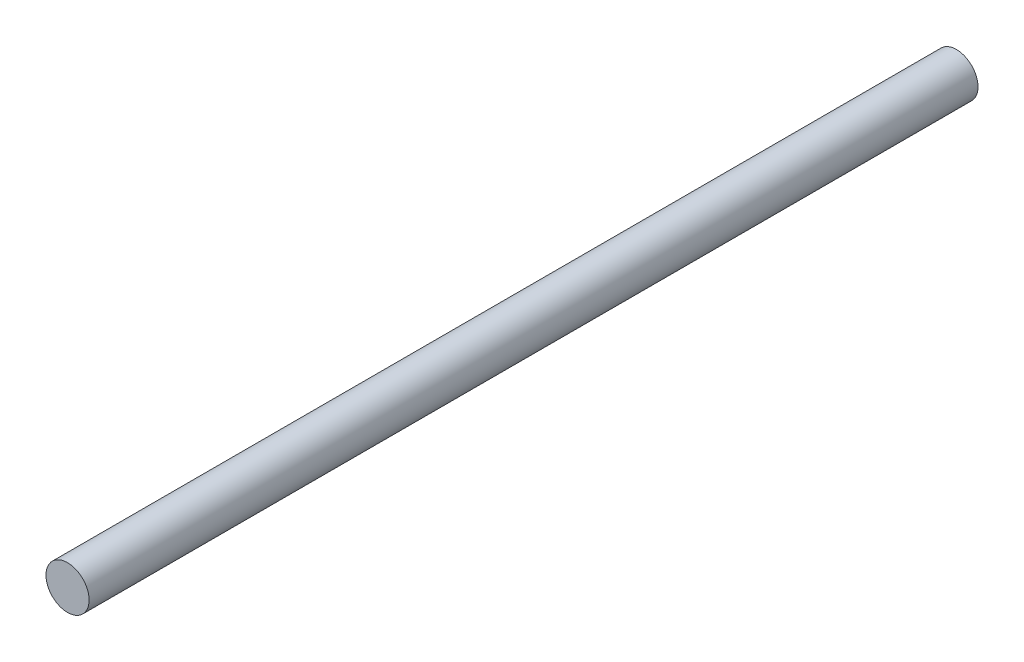
ISO-10303-21;
HEADER;
FILE_DESCRIPTION(('STEP AP214'),'2;1');
FILE_NAME('part.step','',(''),(''),'','','');
FILE_SCHEMA(('AUTOMOTIVE_DESIGN { 1 0 10303 214 1 1 1 1 }'));
ENDSEC;
DATA;
#1=APPLICATION_CONTEXT('core data for automotive mechanical design processes');
#2=APPLICATION_PROTOCOL_DEFINITION('international standard','automotive_design',2000,#1);
#3=PRODUCT_CONTEXT('',#1,'mechanical');
#4=PRODUCT('Part','Part','',(#3));
#5=PRODUCT_RELATED_PRODUCT_CATEGORY('part','',(#4));
#6=PRODUCT_DEFINITION_FORMATION('','',#4);
#7=PRODUCT_DEFINITION_CONTEXT('part definition',#1,'design');
#8=PRODUCT_DEFINITION('design','',#6,#7);
#9=PRODUCT_DEFINITION_SHAPE('','',#8);
#10=(LENGTH_UNIT() NAMED_UNIT(*) SI_UNIT(.MILLI.,.METRE.));
#11=(NAMED_UNIT(*) PLANE_ANGLE_UNIT() SI_UNIT($,.RADIAN.));
#12=(NAMED_UNIT(*) SI_UNIT($,.STERADIAN.) SOLID_ANGLE_UNIT());
#13=UNCERTAINTY_MEASURE_WITH_UNIT(LENGTH_MEASURE(1.E-05),#10,'distance_accuracy_value','');
#14=(GEOMETRIC_REPRESENTATION_CONTEXT(3) GLOBAL_UNCERTAINTY_ASSIGNED_CONTEXT((#13)) GLOBAL_UNIT_ASSIGNED_CONTEXT((#10,
#11,#12)) REPRESENTATION_CONTEXT('',''));
#15=CARTESIAN_POINT('',(0.,0.,0.));
#16=DIRECTION('',(0.,0.,1.));
#17=DIRECTION('',(1.,0.,0.));
#18=AXIS2_PLACEMENT_3D('',#15,#16,#17);
#19=CARTESIAN_POINT('',(0.,0.,103.));
#20=DIRECTION('',(0.,0.,-1.));
#21=DIRECTION('',(-1.,0.,0.));
#22=AXIS2_PLACEMENT_3D('',#19,#20,#21);
#23=CYLINDRICAL_SURFACE('',#22,2.5);
#24=CARTESIAN_POINT('',(0.,0.,103.));
#25=DIRECTION('',(0.,0.,1.));
#26=DIRECTION('',(1.,0.,0.));
#27=AXIS2_PLACEMENT_3D('',#24,#25,#26);
#28=CIRCLE('',#27,2.5);
#29=CARTESIAN_POINT('',(2.5,0.,103.));
#30=VERTEX_POINT('',#29);
#31=EDGE_CURVE('E10',#30,#30,#28,.T.);
#32=ORIENTED_EDGE('',*,*,#31,.F.);
#33=EDGE_LOOP('',(#32));
#34=FACE_BOUND('',#33,.T.);
#35=CARTESIAN_POINT('',(0.,0.,0.));
#36=DIRECTION('',(0.,0.,1.));
#37=DIRECTION('',(1.,0.,0.));
#38=AXIS2_PLACEMENT_3D('',#35,#36,#37);
#39=CIRCLE('',#38,2.5);
#40=CARTESIAN_POINT('',(2.5,0.,0.));
#41=VERTEX_POINT('',#40);
#42=EDGE_CURVE('E42',#41,#41,#39,.T.);
#43=ORIENTED_EDGE('',*,*,#42,.T.);
#44=EDGE_LOOP('',(#43));
#45=FACE_BOUND('',#44,.T.);
#46=ADVANCED_FACE('F39',(#34,#45),#23,.T.);
#47=CARTESIAN_POINT('',(0.,0.,103.));
#48=DIRECTION('',(0.,0.,1.));
#49=DIRECTION('',(1.,0.,0.));
#50=AXIS2_PLACEMENT_3D('',#47,#48,#49);
#51=PLANE('',#50);
#52=ORIENTED_EDGE('',*,*,#31,.T.);
#53=EDGE_LOOP('',(#52));
#54=FACE_BOUND('',#53,.T.);
#55=ADVANCED_FACE('F54',(#54),#51,.T.);
#56=CARTESIAN_POINT('',(0.,0.,0.));
#57=DIRECTION('',(0.,0.,1.));
#58=DIRECTION('',(1.,0.,0.));
#59=AXIS2_PLACEMENT_3D('',#56,#57,#58);
#60=PLANE('',#59);
#61=ORIENTED_EDGE('',*,*,#42,.F.);
#62=EDGE_LOOP('',(#61));
#63=FACE_BOUND('',#62,.T.);
#64=ADVANCED_FACE('F52',(#63),#60,.F.);
#65=CLOSED_SHELL('',(#46,#55,#64));
#66=MANIFOLD_SOLID_BREP('B2',#65);
#67=ADVANCED_BREP_SHAPE_REPRESENTATION('',(#18,#66),#14);
#68=SHAPE_DEFINITION_REPRESENTATION(#9,#67);
ENDSEC;
END-ISO-10303-21;
